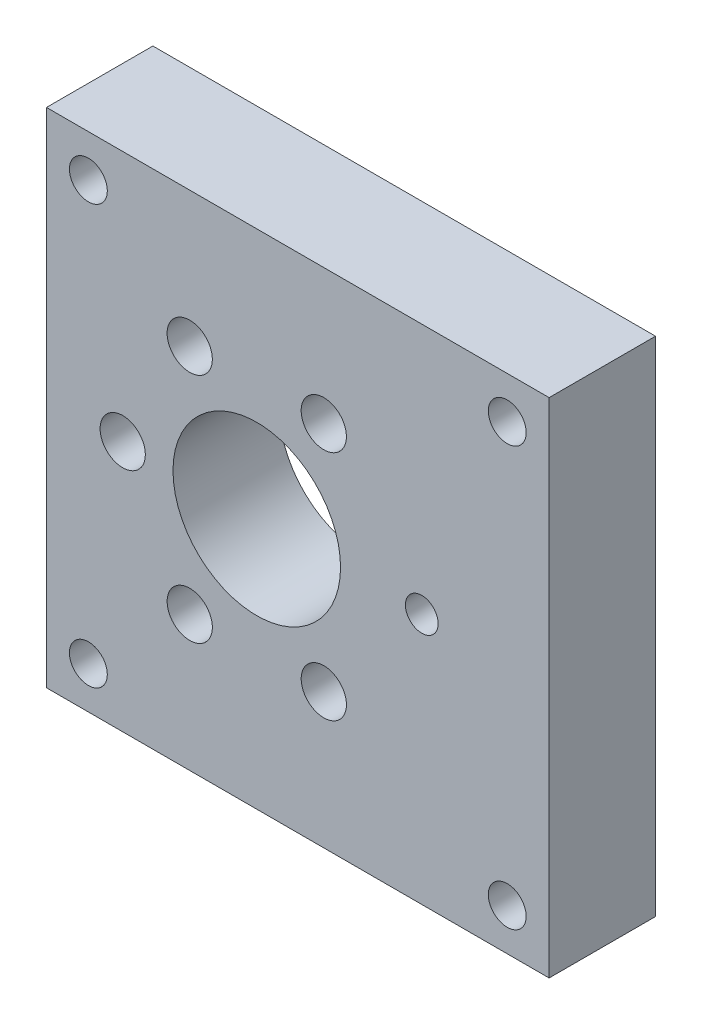
ISO-10303-21;
HEADER;
FILE_DESCRIPTION(('STEP AP214'),'2;1');
FILE_NAME('part.step','',(''),(''),'','','');
FILE_SCHEMA(('AUTOMOTIVE_DESIGN { 1 0 10303 214 1 1 1 1 }'));
ENDSEC;
DATA;
#1=APPLICATION_CONTEXT('core data for automotive mechanical design processes');
#2=APPLICATION_PROTOCOL_DEFINITION('international standard','automotive_design',2000,#1);
#3=PRODUCT_CONTEXT('',#1,'mechanical');
#4=PRODUCT('Part','Part','',(#3));
#5=PRODUCT_RELATED_PRODUCT_CATEGORY('part','',(#4));
#6=PRODUCT_DEFINITION_FORMATION('','',#4);
#7=PRODUCT_DEFINITION_CONTEXT('part definition',#1,'design');
#8=PRODUCT_DEFINITION('design','',#6,#7);
#9=PRODUCT_DEFINITION_SHAPE('','',#8);
#10=(LENGTH_UNIT() NAMED_UNIT(*) SI_UNIT(.MILLI.,.METRE.));
#11=(NAMED_UNIT(*) PLANE_ANGLE_UNIT() SI_UNIT($,.RADIAN.));
#12=(NAMED_UNIT(*) SI_UNIT($,.STERADIAN.) SOLID_ANGLE_UNIT());
#13=UNCERTAINTY_MEASURE_WITH_UNIT(LENGTH_MEASURE(1.E-05),#10,'distance_accuracy_value','');
#14=(GEOMETRIC_REPRESENTATION_CONTEXT(3) GLOBAL_UNCERTAINTY_ASSIGNED_CONTEXT((#13)) GLOBAL_UNIT_ASSIGNED_CONTEXT((#10,
#11,#12)) REPRESENTATION_CONTEXT('',''));
#15=CARTESIAN_POINT('',(0.,0.,0.));
#16=DIRECTION('',(0.,0.,1.));
#17=DIRECTION('',(1.,0.,0.));
#18=AXIS2_PLACEMENT_3D('',#15,#16,#17);
#19=CARTESIAN_POINT('',(0.,0.,6.35));
#20=DIRECTION('',(1.,0.,0.));
#21=DIRECTION('',(0.,1.,0.));
#22=AXIS2_PLACEMENT_3D('',#19,#20,#21);
#23=PLANE('',#22);
#24=DIRECTION('',(0.,-1.,0.));
#25=VECTOR('',#24,1.);
#26=CARTESIAN_POINT('',(0.,0.,0.));
#27=LINE('',#26,#25);
#28=CARTESIAN_POINT('',(0.,30.,0.));
#29=VERTEX_POINT('',#28);
#30=CARTESIAN_POINT('',(0.,0.,0.));
#31=VERTEX_POINT('',#30);
#32=EDGE_CURVE('E100',#29,#31,#27,.T.);
#33=ORIENTED_EDGE('',*,*,#32,.T.);
#34=DIRECTION('',(0.,0.,-1.));
#35=VECTOR('',#34,1.);
#36=CARTESIAN_POINT('',(0.,0.,6.35));
#37=LINE('',#36,#35);
#38=CARTESIAN_POINT('',(0.,0.,6.35));
#39=VERTEX_POINT('',#38);
#40=EDGE_CURVE('E11',#39,#31,#37,.T.);
#41=ORIENTED_EDGE('',*,*,#40,.F.);
#42=DIRECTION('',(0.,-1.,0.));
#43=VECTOR('',#42,1.);
#44=CARTESIAN_POINT('',(0.,0.,6.35));
#45=LINE('',#44,#43);
#46=CARTESIAN_POINT('',(0.,30.,6.35));
#47=VERTEX_POINT('',#46);
#48=EDGE_CURVE('E88',#47,#39,#45,.T.);
#49=ORIENTED_EDGE('',*,*,#48,.F.);
#50=DIRECTION('',(0.,0.,-1.));
#51=VECTOR('',#50,1.);
#52=CARTESIAN_POINT('',(0.,30.,6.35));
#53=LINE('',#52,#51);
#54=EDGE_CURVE('E96',#47,#29,#53,.T.);
#55=ORIENTED_EDGE('',*,*,#54,.T.);
#56=EDGE_LOOP('',(#33,#41,#49,#55));
#57=FACE_BOUND('',#56,.T.);
#58=ADVANCED_FACE('F37',(#57),#23,.F.);
#59=CARTESIAN_POINT('',(0.,0.,6.35));
#60=DIRECTION('',(0.,1.,0.));
#61=DIRECTION('',(0.,0.,1.));
#62=AXIS2_PLACEMENT_3D('',#59,#60,#61);
#63=PLANE('',#62);
#64=DIRECTION('',(1.,0.,0.));
#65=VECTOR('',#64,1.);
#66=CARTESIAN_POINT('',(0.,0.,0.));
#67=LINE('',#66,#65);
#68=CARTESIAN_POINT('',(30.,0.,0.));
#69=VERTEX_POINT('',#68);
#70=EDGE_CURVE('E92',#31,#69,#67,.T.);
#71=ORIENTED_EDGE('',*,*,#70,.T.);
#72=DIRECTION('',(0.,0.,-1.));
#73=VECTOR('',#72,1.);
#74=CARTESIAN_POINT('',(30.,0.,6.35));
#75=LINE('',#74,#73);
#76=CARTESIAN_POINT('',(30.,0.,6.35));
#77=VERTEX_POINT('',#76);
#78=EDGE_CURVE('E45',#77,#69,#75,.T.);
#79=ORIENTED_EDGE('',*,*,#78,.F.);
#80=DIRECTION('',(1.,0.,0.));
#81=VECTOR('',#80,1.);
#82=CARTESIAN_POINT('',(0.,0.,6.35));
#83=LINE('',#82,#81);
#84=EDGE_CURVE('E83',#39,#77,#83,.T.);
#85=ORIENTED_EDGE('',*,*,#84,.F.);
#86=ORIENTED_EDGE('',*,*,#40,.T.);
#87=EDGE_LOOP('',(#71,#79,#85,#86));
#88=FACE_BOUND('',#87,.T.);
#89=ADVANCED_FACE('F91',(#88),#63,.F.);
#90=CARTESIAN_POINT('',(30.,0.,6.35));
#91=DIRECTION('',(-1.,0.,0.));
#92=DIRECTION('',(0.,-1.,0.));
#93=AXIS2_PLACEMENT_3D('',#90,#91,#92);
#94=PLANE('',#93);
#95=DIRECTION('',(0.,1.,0.));
#96=VECTOR('',#95,1.);
#97=CARTESIAN_POINT('',(30.,0.,0.));
#98=LINE('',#97,#96);
#99=CARTESIAN_POINT('',(30.,30.,0.));
#100=VERTEX_POINT('',#99);
#101=EDGE_CURVE('E70',#69,#100,#98,.T.);
#102=ORIENTED_EDGE('',*,*,#101,.T.);
#103=DIRECTION('',(0.,0.,-1.));
#104=VECTOR('',#103,1.);
#105=CARTESIAN_POINT('',(30.,30.,6.35));
#106=LINE('',#105,#104);
#107=CARTESIAN_POINT('',(30.,30.,6.35));
#108=VERTEX_POINT('',#107);
#109=EDGE_CURVE('E93',#108,#100,#106,.T.);
#110=ORIENTED_EDGE('',*,*,#109,.F.);
#111=DIRECTION('',(0.,1.,0.));
#112=VECTOR('',#111,1.);
#113=CARTESIAN_POINT('',(30.,0.,6.35));
#114=LINE('',#113,#112);
#115=EDGE_CURVE('E86',#77,#108,#114,.T.);
#116=ORIENTED_EDGE('',*,*,#115,.F.);
#117=ORIENTED_EDGE('',*,*,#78,.T.);
#118=EDGE_LOOP('',(#102,#110,#116,#117));
#119=FACE_BOUND('',#118,.T.);
#120=ADVANCED_FACE('F94',(#119),#94,.F.);
#121=CARTESIAN_POINT('',(0.,30.,6.35));
#122=DIRECTION('',(0.,-1.,0.));
#123=DIRECTION('',(0.,0.,-1.));
#124=AXIS2_PLACEMENT_3D('',#121,#122,#123);
#125=PLANE('',#124);
#126=DIRECTION('',(-1.,0.,0.));
#127=VECTOR('',#126,1.);
#128=CARTESIAN_POINT('',(0.,30.,0.));
#129=LINE('',#128,#127);
#130=EDGE_CURVE('E76',#100,#29,#129,.T.);
#131=ORIENTED_EDGE('',*,*,#130,.T.);
#132=ORIENTED_EDGE('',*,*,#54,.F.);
#133=DIRECTION('',(-1.,0.,0.));
#134=VECTOR('',#133,1.);
#135=CARTESIAN_POINT('',(0.,30.,6.35));
#136=LINE('',#135,#134);
#137=EDGE_CURVE('E53',#108,#47,#136,.T.);
#138=ORIENTED_EDGE('',*,*,#137,.F.);
#139=ORIENTED_EDGE('',*,*,#109,.T.);
#140=EDGE_LOOP('',(#131,#132,#138,#139));
#141=FACE_BOUND('',#140,.T.);
#142=ADVANCED_FACE('F108',(#141),#125,.F.);
#143=CARTESIAN_POINT('',(0.,0.,6.35));
#144=DIRECTION('',(0.,0.,-1.));
#145=DIRECTION('',(-1.,0.,0.));
#146=AXIS2_PLACEMENT_3D('',#143,#144,#145);
#147=PLANE('',#146);
#148=CARTESIAN_POINT('',(22.40032,15.,6.35));
#149=DIRECTION('',(0.,0.,1.));
#150=DIRECTION('',(1.,0.,0.));
#151=AXIS2_PLACEMENT_3D('',#148,#149,#150);
#152=CIRCLE('',#151,0.977899999999999);
#153=CARTESIAN_POINT('',(23.37822,15.,6.35));
#154=VERTEX_POINT('',#153);
#155=EDGE_CURVE('E174',#154,#154,#152,.T.);
#156=ORIENTED_EDGE('',*,*,#155,.F.);
#157=EDGE_LOOP('',(#156));
#158=FACE_BOUND('',#157,.T.);
#159=CARTESIAN_POINT('',(16.5513245980022,8.07256604225671,6.35));
#160=DIRECTION('',(0.,0.,1.));
#161=DIRECTION('',(1.,0.,0.));
#162=AXIS2_PLACEMENT_3D('',#159,#160,#161);
#163=CIRCLE('',#162,1.34999999999999);
#164=CARTESIAN_POINT('',(17.9013245980022,8.07256604225671,6.35));
#165=VERTEX_POINT('',#164);
#166=EDGE_CURVE('E170',#165,#165,#163,.T.);
#167=ORIENTED_EDGE('',*,*,#166,.F.);
#168=EDGE_LOOP('',(#167));
#169=FACE_BOUND('',#168,.T.);
#170=CARTESIAN_POINT('',(8.55032463705571,8.07177551402744,6.35));
#171=DIRECTION('',(0.,0.,1.));
#172=DIRECTION('',(1.,0.,0.));
#173=AXIS2_PLACEMENT_3D('',#170,#171,#172);
#174=CIRCLE('',#173,1.34999999999999);
#175=CARTESIAN_POINT('',(9.9003246370557,8.07177551402744,6.35));
#176=VERTEX_POINT('',#175);
#177=EDGE_CURVE('E164',#176,#176,#174,.T.);
#178=ORIENTED_EDGE('',*,*,#177,.F.);
#179=EDGE_LOOP('',(#178));
#180=FACE_BOUND('',#179,.T.);
#181=CARTESIAN_POINT('',(4.54914003905354,15.0004494717708,6.35));
#182=DIRECTION('',(0.,0.,1.));
#183=DIRECTION('',(1.,0.,0.));
#184=AXIS2_PLACEMENT_3D('',#181,#182,#183);
#185=CIRCLE('',#184,1.34999999999999);
#186=CARTESIAN_POINT('',(5.89914003905353,15.0004494717708,6.35));
#187=VERTEX_POINT('',#186);
#188=EDGE_CURVE('E158',#187,#187,#185,.T.);
#189=ORIENTED_EDGE('',*,*,#188,.F.);
#190=EDGE_LOOP('',(#189));
#191=FACE_BOUND('',#190,.T.);
#192=CARTESIAN_POINT('',(8.54895540199785,21.9299139577433,6.35));
#193=DIRECTION('',(0.,0.,1.));
#194=DIRECTION('',(1.,0.,0.));
#195=AXIS2_PLACEMENT_3D('',#192,#193,#194);
#196=CIRCLE('',#195,1.34999999999999);
#197=CARTESIAN_POINT('',(9.89895540199784,21.9299139577433,6.35));
#198=VERTEX_POINT('',#197);
#199=EDGE_CURVE('E152',#198,#198,#196,.T.);
#200=ORIENTED_EDGE('',*,*,#199,.F.);
#201=EDGE_LOOP('',(#200));
#202=FACE_BOUND('',#201,.T.);
#203=CARTESIAN_POINT('',(16.5499553629443,21.9307044859725,6.35));
#204=DIRECTION('',(0.,0.,1.));
#205=DIRECTION('',(1.,0.,0.));
#206=AXIS2_PLACEMENT_3D('',#203,#204,#205);
#207=CIRCLE('',#206,1.34999999999999);
#208=CARTESIAN_POINT('',(17.8999553629443,21.9307044859725,6.35));
#209=VERTEX_POINT('',#208);
#210=EDGE_CURVE('E146',#209,#209,#207,.T.);
#211=ORIENTED_EDGE('',*,*,#210,.F.);
#212=EDGE_LOOP('',(#211));
#213=FACE_BOUND('',#212,.T.);
#214=CARTESIAN_POINT('',(12.55014,15.00124,6.35));
#215=DIRECTION('',(0.,0.,1.));
#216=DIRECTION('',(1.,0.,0.));
#217=AXIS2_PLACEMENT_3D('',#214,#215,#216);
#218=CIRCLE('',#217,4.99999);
#219=CARTESIAN_POINT('',(17.55013,15.00124,6.35));
#220=VERTEX_POINT('',#219);
#221=EDGE_CURVE('E138',#220,#220,#218,.T.);
#222=ORIENTED_EDGE('',*,*,#221,.F.);
#223=EDGE_LOOP('',(#222));
#224=FACE_BOUND('',#223,.T.);
#225=CARTESIAN_POINT('',(2.5,27.5,6.35));
#226=DIRECTION('',(0.,0.,1.));
#227=DIRECTION('',(1.,0.,0.));
#228=AXIS2_PLACEMENT_3D('',#225,#226,#227);
#229=CIRCLE('',#228,1.1303);
#230=CARTESIAN_POINT('',(3.6303,27.5,6.35));
#231=VERTEX_POINT('',#230);
#232=EDGE_CURVE('E134',#231,#231,#229,.T.);
#233=ORIENTED_EDGE('',*,*,#232,.F.);
#234=EDGE_LOOP('',(#233));
#235=FACE_BOUND('',#234,.T.);
#236=CARTESIAN_POINT('',(27.5,27.5,6.35));
#237=DIRECTION('',(0.,0.,1.));
#238=DIRECTION('',(1.,0.,0.));
#239=AXIS2_PLACEMENT_3D('',#236,#237,#238);
#240=CIRCLE('',#239,1.1303);
#241=CARTESIAN_POINT('',(28.6303,27.5,6.35));
#242=VERTEX_POINT('',#241);
#243=EDGE_CURVE('E128',#242,#242,#240,.T.);
#244=ORIENTED_EDGE('',*,*,#243,.F.);
#245=EDGE_LOOP('',(#244));
#246=FACE_BOUND('',#245,.T.);
#247=CARTESIAN_POINT('',(2.50000000000001,2.5,6.35));
#248=DIRECTION('',(0.,0.,1.));
#249=DIRECTION('',(1.,0.,0.));
#250=AXIS2_PLACEMENT_3D('',#247,#248,#249);
#251=CIRCLE('',#250,1.1303);
#252=CARTESIAN_POINT('',(3.6303,2.5,6.35));
#253=VERTEX_POINT('',#252);
#254=EDGE_CURVE('E122',#253,#253,#251,.T.);
#255=ORIENTED_EDGE('',*,*,#254,.F.);
#256=EDGE_LOOP('',(#255));
#257=FACE_BOUND('',#256,.T.);
#258=CARTESIAN_POINT('',(27.5,2.5,6.35));
#259=DIRECTION('',(0.,0.,1.));
#260=DIRECTION('',(1.,0.,0.));
#261=AXIS2_PLACEMENT_3D('',#258,#259,#260);
#262=CIRCLE('',#261,1.1303);
#263=CARTESIAN_POINT('',(28.6303,2.5,6.35));
#264=VERTEX_POINT('',#263);
#265=EDGE_CURVE('E116',#264,#264,#262,.T.);
#266=ORIENTED_EDGE('',*,*,#265,.F.);
#267=EDGE_LOOP('',(#266));
#268=FACE_BOUND('',#267,.T.);
#269=ORIENTED_EDGE('',*,*,#48,.T.);
#270=ORIENTED_EDGE('',*,*,#84,.T.);
#271=ORIENTED_EDGE('',*,*,#115,.T.);
#272=ORIENTED_EDGE('',*,*,#137,.T.);
#273=EDGE_LOOP('',(#269,#270,#271,#272));
#274=FACE_BOUND('',#273,.T.);
#275=ADVANCED_FACE('F84',(#158,#169,#180,#191,#202,#213,#224,#235,#246,#257,#268,#274),#147,.F.);
#276=CARTESIAN_POINT('',(0.,0.,0.));
#277=DIRECTION('',(0.,0.,-1.));
#278=DIRECTION('',(-1.,0.,0.));
#279=AXIS2_PLACEMENT_3D('',#276,#277,#278);
#280=PLANE('',#279);
#281=CARTESIAN_POINT('',(22.40032,15.,0.));
#282=DIRECTION('',(0.,0.,1.));
#283=DIRECTION('',(1.,0.,0.));
#284=AXIS2_PLACEMENT_3D('',#281,#282,#283);
#285=CIRCLE('',#284,0.977899999999999);
#286=CARTESIAN_POINT('',(23.37822,15.,0.));
#287=VERTEX_POINT('',#286);
#288=EDGE_CURVE('E173',#287,#287,#285,.T.);
#289=ORIENTED_EDGE('',*,*,#288,.T.);
#290=EDGE_LOOP('',(#289));
#291=FACE_BOUND('',#290,.T.);
#292=CARTESIAN_POINT('',(16.5513245980022,8.07256604225671,0.));
#293=DIRECTION('',(0.,0.,1.));
#294=DIRECTION('',(1.,0.,0.));
#295=AXIS2_PLACEMENT_3D('',#292,#293,#294);
#296=CIRCLE('',#295,1.35);
#297=CARTESIAN_POINT('',(17.9013245980022,8.07256604225671,0.));
#298=VERTEX_POINT('',#297);
#299=EDGE_CURVE('E167',#298,#298,#296,.T.);
#300=ORIENTED_EDGE('',*,*,#299,.T.);
#301=EDGE_LOOP('',(#300));
#302=FACE_BOUND('',#301,.T.);
#303=CARTESIAN_POINT('',(8.55032463705571,8.07177551402744,0.));
#304=DIRECTION('',(0.,0.,1.));
#305=DIRECTION('',(1.,0.,0.));
#306=AXIS2_PLACEMENT_3D('',#303,#304,#305);
#307=CIRCLE('',#306,1.35);
#308=CARTESIAN_POINT('',(9.90032463705571,8.07177551402744,0.));
#309=VERTEX_POINT('',#308);
#310=EDGE_CURVE('E161',#309,#309,#307,.T.);
#311=ORIENTED_EDGE('',*,*,#310,.T.);
#312=EDGE_LOOP('',(#311));
#313=FACE_BOUND('',#312,.T.);
#314=CARTESIAN_POINT('',(4.54914003905354,15.0004494717708,0.));
#315=DIRECTION('',(0.,0.,1.));
#316=DIRECTION('',(1.,0.,0.));
#317=AXIS2_PLACEMENT_3D('',#314,#315,#316);
#318=CIRCLE('',#317,1.35);
#319=CARTESIAN_POINT('',(5.89914003905354,15.0004494717708,0.));
#320=VERTEX_POINT('',#319);
#321=EDGE_CURVE('E155',#320,#320,#318,.T.);
#322=ORIENTED_EDGE('',*,*,#321,.T.);
#323=EDGE_LOOP('',(#322));
#324=FACE_BOUND('',#323,.T.);
#325=CARTESIAN_POINT('',(8.54895540199785,21.9299139577433,0.));
#326=DIRECTION('',(0.,0.,1.));
#327=DIRECTION('',(1.,0.,0.));
#328=AXIS2_PLACEMENT_3D('',#325,#326,#327);
#329=CIRCLE('',#328,1.35);
#330=CARTESIAN_POINT('',(9.89895540199785,21.9299139577433,0.));
#331=VERTEX_POINT('',#330);
#332=EDGE_CURVE('E149',#331,#331,#329,.T.);
#333=ORIENTED_EDGE('',*,*,#332,.T.);
#334=EDGE_LOOP('',(#333));
#335=FACE_BOUND('',#334,.T.);
#336=CARTESIAN_POINT('',(16.5499553629443,21.9307044859725,0.));
#337=DIRECTION('',(0.,0.,1.));
#338=DIRECTION('',(1.,0.,0.));
#339=AXIS2_PLACEMENT_3D('',#336,#337,#338);
#340=CIRCLE('',#339,1.35);
#341=CARTESIAN_POINT('',(17.8999553629443,21.9307044859725,0.));
#342=VERTEX_POINT('',#341);
#343=EDGE_CURVE('E141',#342,#342,#340,.T.);
#344=ORIENTED_EDGE('',*,*,#343,.T.);
#345=EDGE_LOOP('',(#344));
#346=FACE_BOUND('',#345,.T.);
#347=CARTESIAN_POINT('',(12.55014,15.00124,0.));
#348=DIRECTION('',(0.,0.,1.));
#349=DIRECTION('',(1.,0.,0.));
#350=AXIS2_PLACEMENT_3D('',#347,#348,#349);
#351=CIRCLE('',#350,4.99999);
#352=CARTESIAN_POINT('',(17.55013,15.00124,0.));
#353=VERTEX_POINT('',#352);
#354=EDGE_CURVE('E137',#353,#353,#351,.T.);
#355=ORIENTED_EDGE('',*,*,#354,.T.);
#356=EDGE_LOOP('',(#355));
#357=FACE_BOUND('',#356,.T.);
#358=CARTESIAN_POINT('',(2.5,27.5,0.));
#359=DIRECTION('',(0.,0.,1.));
#360=DIRECTION('',(1.,0.,0.));
#361=AXIS2_PLACEMENT_3D('',#358,#359,#360);
#362=CIRCLE('',#361,1.1303);
#363=CARTESIAN_POINT('',(3.6303,27.5,0.));
#364=VERTEX_POINT('',#363);
#365=EDGE_CURVE('E131',#364,#364,#362,.T.);
#366=ORIENTED_EDGE('',*,*,#365,.T.);
#367=EDGE_LOOP('',(#366));
#368=FACE_BOUND('',#367,.T.);
#369=CARTESIAN_POINT('',(27.5,27.5,0.));
#370=DIRECTION('',(0.,0.,1.));
#371=DIRECTION('',(1.,0.,0.));
#372=AXIS2_PLACEMENT_3D('',#369,#370,#371);
#373=CIRCLE('',#372,1.1303);
#374=CARTESIAN_POINT('',(28.6303,27.5,0.));
#375=VERTEX_POINT('',#374);
#376=EDGE_CURVE('E125',#375,#375,#373,.T.);
#377=ORIENTED_EDGE('',*,*,#376,.T.);
#378=EDGE_LOOP('',(#377));
#379=FACE_BOUND('',#378,.T.);
#380=CARTESIAN_POINT('',(2.50000000000001,2.5,0.));
#381=DIRECTION('',(0.,0.,1.));
#382=DIRECTION('',(1.,0.,0.));
#383=AXIS2_PLACEMENT_3D('',#380,#381,#382);
#384=CIRCLE('',#383,1.1303);
#385=CARTESIAN_POINT('',(3.6303,2.5,0.));
#386=VERTEX_POINT('',#385);
#387=EDGE_CURVE('E119',#386,#386,#384,.T.);
#388=ORIENTED_EDGE('',*,*,#387,.T.);
#389=EDGE_LOOP('',(#388));
#390=FACE_BOUND('',#389,.T.);
#391=CARTESIAN_POINT('',(27.5,2.5,0.));
#392=DIRECTION('',(0.,0.,1.));
#393=DIRECTION('',(1.,0.,0.));
#394=AXIS2_PLACEMENT_3D('',#391,#392,#393);
#395=CIRCLE('',#394,1.1303);
#396=CARTESIAN_POINT('',(28.6303,2.5,0.));
#397=VERTEX_POINT('',#396);
#398=EDGE_CURVE('E103',#397,#397,#395,.T.);
#399=ORIENTED_EDGE('',*,*,#398,.T.);
#400=EDGE_LOOP('',(#399));
#401=FACE_BOUND('',#400,.T.);
#402=ORIENTED_EDGE('',*,*,#32,.F.);
#403=ORIENTED_EDGE('',*,*,#130,.F.);
#404=ORIENTED_EDGE('',*,*,#101,.F.);
#405=ORIENTED_EDGE('',*,*,#70,.F.);
#406=EDGE_LOOP('',(#402,#403,#404,#405));
#407=FACE_BOUND('',#406,.T.);
#408=ADVANCED_FACE('F111',(#291,#302,#313,#324,#335,#346,#357,#368,#379,#390,#401,#407),#280,.T.);
#409=CARTESIAN_POINT('',(27.5,2.5,6.35));
#410=DIRECTION('',(0.,0.,1.));
#411=DIRECTION('',(1.,0.,0.));
#412=AXIS2_PLACEMENT_3D('',#409,#410,#411);
#413=CYLINDRICAL_SURFACE('',#412,1.1303);
#414=ORIENTED_EDGE('',*,*,#398,.F.);
#415=EDGE_LOOP('',(#414));
#416=FACE_BOUND('',#415,.T.);
#417=ORIENTED_EDGE('',*,*,#265,.T.);
#418=EDGE_LOOP('',(#417));
#419=FACE_BOUND('',#418,.T.);
#420=ADVANCED_FACE('F212',(#416,#419),#413,.F.);
#421=CARTESIAN_POINT('',(2.50000000000001,2.5,6.35));
#422=DIRECTION('',(0.,0.,1.));
#423=DIRECTION('',(1.,0.,0.));
#424=AXIS2_PLACEMENT_3D('',#421,#422,#423);
#425=CYLINDRICAL_SURFACE('',#424,1.1303);
#426=ORIENTED_EDGE('',*,*,#387,.F.);
#427=EDGE_LOOP('',(#426));
#428=FACE_BOUND('',#427,.T.);
#429=ORIENTED_EDGE('',*,*,#254,.T.);
#430=EDGE_LOOP('',(#429));
#431=FACE_BOUND('',#430,.T.);
#432=ADVANCED_FACE('F214',(#428,#431),#425,.F.);
#433=CARTESIAN_POINT('',(27.5,27.5,6.35));
#434=DIRECTION('',(0.,0.,1.));
#435=DIRECTION('',(1.,0.,0.));
#436=AXIS2_PLACEMENT_3D('',#433,#434,#435);
#437=CYLINDRICAL_SURFACE('',#436,1.1303);
#438=ORIENTED_EDGE('',*,*,#376,.F.);
#439=EDGE_LOOP('',(#438));
#440=FACE_BOUND('',#439,.T.);
#441=ORIENTED_EDGE('',*,*,#243,.T.);
#442=EDGE_LOOP('',(#441));
#443=FACE_BOUND('',#442,.T.);
#444=ADVANCED_FACE('F221',(#440,#443),#437,.F.);
#445=CARTESIAN_POINT('',(2.5,27.5,6.35));
#446=DIRECTION('',(0.,0.,1.));
#447=DIRECTION('',(1.,0.,0.));
#448=AXIS2_PLACEMENT_3D('',#445,#446,#447);
#449=CYLINDRICAL_SURFACE('',#448,1.1303);
#450=ORIENTED_EDGE('',*,*,#365,.F.);
#451=EDGE_LOOP('',(#450));
#452=FACE_BOUND('',#451,.T.);
#453=ORIENTED_EDGE('',*,*,#232,.T.);
#454=EDGE_LOOP('',(#453));
#455=FACE_BOUND('',#454,.T.);
#456=ADVANCED_FACE('F304',(#452,#455),#449,.F.);
#457=CARTESIAN_POINT('',(12.55014,15.00124,0.));
#458=DIRECTION('',(0.,0.,1.));
#459=DIRECTION('',(1.,0.,0.));
#460=AXIS2_PLACEMENT_3D('',#457,#458,#459);
#461=CYLINDRICAL_SURFACE('',#460,4.99999);
#462=ORIENTED_EDGE('',*,*,#354,.F.);
#463=EDGE_LOOP('',(#462));
#464=FACE_BOUND('',#463,.T.);
#465=ORIENTED_EDGE('',*,*,#221,.T.);
#466=EDGE_LOOP('',(#465));
#467=FACE_BOUND('',#466,.T.);
#468=ADVANCED_FACE('F296',(#464,#467),#461,.F.);
#469=CARTESIAN_POINT('',(16.5499553629443,21.9307044859725,6.35));
#470=DIRECTION('',(0.,0.,1.));
#471=DIRECTION('',(1.,0.,0.));
#472=AXIS2_PLACEMENT_3D('',#469,#470,#471);
#473=CYLINDRICAL_SURFACE('',#472,1.34999999999999);
#474=ORIENTED_EDGE('',*,*,#343,.F.);
#475=EDGE_LOOP('',(#474));
#476=FACE_BOUND('',#475,.T.);
#477=ORIENTED_EDGE('',*,*,#210,.T.);
#478=EDGE_LOOP('',(#477));
#479=FACE_BOUND('',#478,.T.);
#480=ADVANCED_FACE('F288',(#476,#479),#473,.F.);
#481=CARTESIAN_POINT('',(8.54895540199785,21.9299139577433,6.35));
#482=DIRECTION('',(0.,0.,1.));
#483=DIRECTION('',(1.,0.,0.));
#484=AXIS2_PLACEMENT_3D('',#481,#482,#483);
#485=CYLINDRICAL_SURFACE('',#484,1.34999999999999);
#486=ORIENTED_EDGE('',*,*,#332,.F.);
#487=EDGE_LOOP('',(#486));
#488=FACE_BOUND('',#487,.T.);
#489=ORIENTED_EDGE('',*,*,#199,.T.);
#490=EDGE_LOOP('',(#489));
#491=FACE_BOUND('',#490,.T.);
#492=ADVANCED_FACE('F280',(#488,#491),#485,.F.);
#493=CARTESIAN_POINT('',(4.54914003905354,15.0004494717708,6.35));
#494=DIRECTION('',(0.,0.,1.));
#495=DIRECTION('',(1.,0.,0.));
#496=AXIS2_PLACEMENT_3D('',#493,#494,#495);
#497=CYLINDRICAL_SURFACE('',#496,1.34999999999999);
#498=ORIENTED_EDGE('',*,*,#321,.F.);
#499=EDGE_LOOP('',(#498));
#500=FACE_BOUND('',#499,.T.);
#501=ORIENTED_EDGE('',*,*,#188,.T.);
#502=EDGE_LOOP('',(#501));
#503=FACE_BOUND('',#502,.T.);
#504=ADVANCED_FACE('F272',(#500,#503),#497,.F.);
#505=CARTESIAN_POINT('',(8.55032463705571,8.07177551402744,6.35));
#506=DIRECTION('',(0.,0.,1.));
#507=DIRECTION('',(1.,0.,0.));
#508=AXIS2_PLACEMENT_3D('',#505,#506,#507);
#509=CYLINDRICAL_SURFACE('',#508,1.34999999999999);
#510=ORIENTED_EDGE('',*,*,#310,.F.);
#511=EDGE_LOOP('',(#510));
#512=FACE_BOUND('',#511,.T.);
#513=ORIENTED_EDGE('',*,*,#177,.T.);
#514=EDGE_LOOP('',(#513));
#515=FACE_BOUND('',#514,.T.);
#516=ADVANCED_FACE('F265',(#512,#515),#509,.F.);
#517=CARTESIAN_POINT('',(16.5513245980022,8.07256604225671,6.35));
#518=DIRECTION('',(0.,0.,1.));
#519=DIRECTION('',(1.,0.,0.));
#520=AXIS2_PLACEMENT_3D('',#517,#518,#519);
#521=CYLINDRICAL_SURFACE('',#520,1.34999999999999);
#522=ORIENTED_EDGE('',*,*,#299,.F.);
#523=EDGE_LOOP('',(#522));
#524=FACE_BOUND('',#523,.T.);
#525=ORIENTED_EDGE('',*,*,#166,.T.);
#526=EDGE_LOOP('',(#525));
#527=FACE_BOUND('',#526,.T.);
#528=ADVANCED_FACE('F185',(#524,#527),#521,.F.);
#529=CARTESIAN_POINT('',(22.40032,15.,0.));
#530=DIRECTION('',(0.,0.,1.));
#531=DIRECTION('',(1.,0.,0.));
#532=AXIS2_PLACEMENT_3D('',#529,#530,#531);
#533=CYLINDRICAL_SURFACE('',#532,0.977899999999999);
#534=ORIENTED_EDGE('',*,*,#288,.F.);
#535=EDGE_LOOP('',(#534));
#536=FACE_BOUND('',#535,.T.);
#537=ORIENTED_EDGE('',*,*,#155,.T.);
#538=EDGE_LOOP('',(#537));
#539=FACE_BOUND('',#538,.T.);
#540=ADVANCED_FACE('F182',(#536,#539),#533,.F.);
#541=CLOSED_SHELL('',(#58,#89,#120,#142,#275,#408,#420,#432,#444,#456,#468,#480,#492,#504,#516,
#528,#540));
#542=MANIFOLD_SOLID_BREP('B2',#541);
#543=ADVANCED_BREP_SHAPE_REPRESENTATION('',(#18,#542),#14);
#544=SHAPE_DEFINITION_REPRESENTATION(#9,#543);
ENDSEC;
END-ISO-10303-21;
